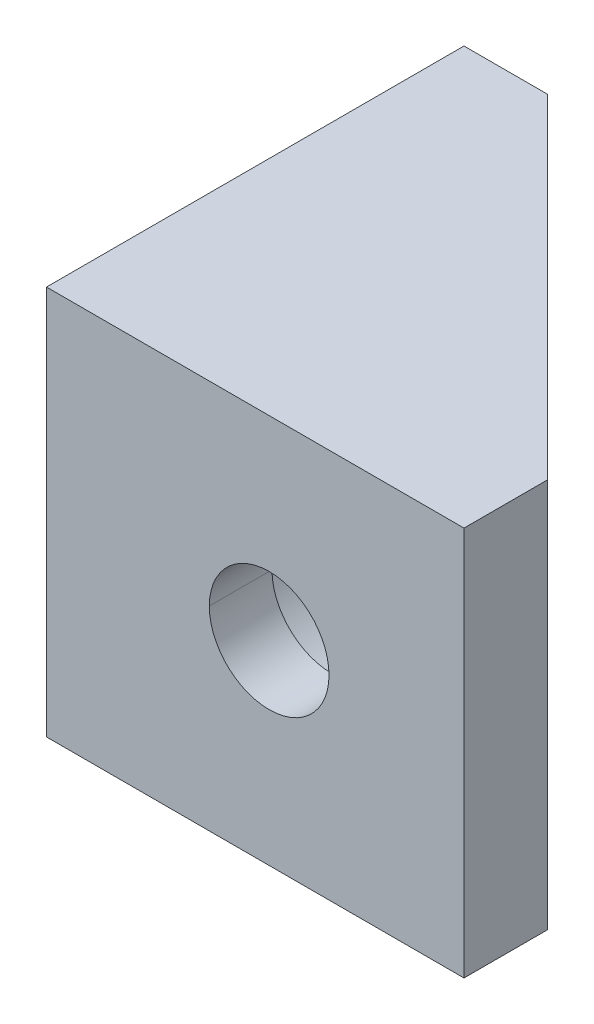
ISO-10303-21;
HEADER;
FILE_DESCRIPTION(('STEP AP214'),'2;1');
FILE_NAME('part.step','',(''),(''),'','','');
FILE_SCHEMA(('AUTOMOTIVE_DESIGN { 1 0 10303 214 1 1 1 1 }'));
ENDSEC;
DATA;
#1=APPLICATION_CONTEXT('core data for automotive mechanical design processes');
#2=APPLICATION_PROTOCOL_DEFINITION('international standard','automotive_design',2000,#1);
#3=PRODUCT_CONTEXT('',#1,'mechanical');
#4=PRODUCT('Part','Part','',(#3));
#5=PRODUCT_RELATED_PRODUCT_CATEGORY('part','',(#4));
#6=PRODUCT_DEFINITION_FORMATION('','',#4);
#7=PRODUCT_DEFINITION_CONTEXT('part definition',#1,'design');
#8=PRODUCT_DEFINITION('design','',#6,#7);
#9=PRODUCT_DEFINITION_SHAPE('','',#8);
#10=(LENGTH_UNIT() NAMED_UNIT(*) SI_UNIT(.MILLI.,.METRE.));
#11=(NAMED_UNIT(*) PLANE_ANGLE_UNIT() SI_UNIT($,.RADIAN.));
#12=(NAMED_UNIT(*) SI_UNIT($,.STERADIAN.) SOLID_ANGLE_UNIT());
#13=UNCERTAINTY_MEASURE_WITH_UNIT(LENGTH_MEASURE(1.E-05),#10,'distance_accuracy_value','');
#14=(GEOMETRIC_REPRESENTATION_CONTEXT(3) GLOBAL_UNCERTAINTY_ASSIGNED_CONTEXT((#13)) GLOBAL_UNIT_ASSIGNED_CONTEXT((#10,
#11,#12)) REPRESENTATION_CONTEXT('',''));
#15=CARTESIAN_POINT('',(0.,0.,0.));
#16=DIRECTION('',(0.,0.,1.));
#17=DIRECTION('',(1.,0.,0.));
#18=AXIS2_PLACEMENT_3D('',#15,#16,#17);
#19=CARTESIAN_POINT('',(0.,7.,-2.25));
#20=DIRECTION('',(0.,0.,-1.));
#21=DIRECTION('',(-1.,0.,0.));
#22=AXIS2_PLACEMENT_3D('',#19,#20,#21);
#23=PLANE('',#22);
#24=CARTESIAN_POINT('',(8.,0.,-2.25000000000003));
#25=DIRECTION('',(0.,0.,1.));
#26=DIRECTION('',(-1.,0.,0.));
#27=AXIS2_PLACEMENT_3D('',#24,#25,#26);
#28=CIRCLE('',#27,2.15);
#29=CARTESIAN_POINT('',(5.85,0.,-2.25000000000002));
#30=VERTEX_POINT('',#29);
#31=CARTESIAN_POINT('',(10.15,0.,-2.25000000000004));
#32=VERTEX_POINT('',#31);
#33=EDGE_CURVE('E211',#30,#32,#28,.T.);
#34=ORIENTED_EDGE('',*,*,#33,.T.);
#35=CARTESIAN_POINT('',(8.,0.,-2.25000000000003));
#36=DIRECTION('',(0.,0.,1.));
#37=DIRECTION('',(-1.,0.,0.));
#38=AXIS2_PLACEMENT_3D('',#35,#36,#37);
#39=CIRCLE('',#38,2.15);
#40=EDGE_CURVE('E19',#32,#30,#39,.T.);
#41=ORIENTED_EDGE('',*,*,#40,.T.);
#42=EDGE_LOOP('',(#34,#41));
#43=FACE_BOUND('',#42,.T.);
#44=CARTESIAN_POINT('',(8.,0.,-2.25000000000004));
#45=DIRECTION('',(0.,0.,1.));
#46=DIRECTION('',(-1.,0.,0.));
#47=AXIS2_PLACEMENT_3D('',#44,#45,#46);
#48=CIRCLE('',#47,4.);
#49=CARTESIAN_POINT('',(12.,0.,-2.25000000000005));
#50=VERTEX_POINT('',#49);
#51=CARTESIAN_POINT('',(4.,0.,-2.25));
#52=VERTEX_POINT('',#51);
#53=EDGE_CURVE('E10',#50,#52,#48,.T.);
#54=ORIENTED_EDGE('',*,*,#53,.F.);
#55=CARTESIAN_POINT('',(8.,0.,-2.25000000000004));
#56=DIRECTION('',(0.,0.,1.));
#57=DIRECTION('',(-1.,0.,0.));
#58=AXIS2_PLACEMENT_3D('',#55,#56,#57);
#59=CIRCLE('',#58,4.);
#60=EDGE_CURVE('E237',#52,#50,#59,.T.);
#61=ORIENTED_EDGE('',*,*,#60,.F.);
#62=EDGE_LOOP('',(#54,#61));
#63=FACE_BOUND('',#62,.T.);
#64=ADVANCED_FACE('F15',(#43,#63),#23,.T.);
#65=CARTESIAN_POINT('',(2.25,7.,0.));
#66=DIRECTION('',(1.,0.,0.));
#67=DIRECTION('',(0.,1.,0.));
#68=AXIS2_PLACEMENT_3D('',#65,#66,#67);
#69=PLANE('',#68);
#70=CARTESIAN_POINT('',(2.25,0.,-8.));
#71=DIRECTION('',(1.,0.,0.));
#72=DIRECTION('',(0.,0.,-1.));
#73=AXIS2_PLACEMENT_3D('',#70,#71,#72);
#74=CIRCLE('',#73,2.15);
#75=CARTESIAN_POINT('',(2.25,0.,-10.15));
#76=VERTEX_POINT('',#75);
#77=CARTESIAN_POINT('',(2.25,0.,-5.85));
#78=VERTEX_POINT('',#77);
#79=EDGE_CURVE('E228',#76,#78,#74,.T.);
#80=ORIENTED_EDGE('',*,*,#79,.F.);
#81=CARTESIAN_POINT('',(2.25,0.,-8.));
#82=DIRECTION('',(1.,0.,0.));
#83=DIRECTION('',(0.,0.,-1.));
#84=AXIS2_PLACEMENT_3D('',#81,#82,#83);
#85=CIRCLE('',#84,2.15);
#86=EDGE_CURVE('E221',#78,#76,#85,.T.);
#87=ORIENTED_EDGE('',*,*,#86,.F.);
#88=EDGE_LOOP('',(#80,#87));
#89=FACE_BOUND('',#88,.T.);
#90=CARTESIAN_POINT('',(2.25,0.,-8.));
#91=DIRECTION('',(-1.,0.,0.));
#92=DIRECTION('',(0.,0.,-1.));
#93=AXIS2_PLACEMENT_3D('',#90,#91,#92);
#94=CIRCLE('',#93,4.);
#95=CARTESIAN_POINT('',(2.25,0.,-4.));
#96=VERTEX_POINT('',#95);
#97=CARTESIAN_POINT('',(2.25,0.,-12.));
#98=VERTEX_POINT('',#97);
#99=EDGE_CURVE('E188',#96,#98,#94,.T.);
#100=ORIENTED_EDGE('',*,*,#99,.F.);
#101=CARTESIAN_POINT('',(2.25,0.,-8.));
#102=DIRECTION('',(-1.,0.,0.));
#103=DIRECTION('',(0.,0.,-1.));
#104=AXIS2_PLACEMENT_3D('',#101,#102,#103);
#105=CIRCLE('',#104,4.);
#106=EDGE_CURVE('E340',#98,#96,#105,.T.);
#107=ORIENTED_EDGE('',*,*,#106,.F.);
#108=EDGE_LOOP('',(#100,#107));
#109=FACE_BOUND('',#108,.T.);
#110=ADVANCED_FACE('F364',(#89,#109),#69,.T.);
#111=CARTESIAN_POINT('',(8.,0.,-15.));
#112=DIRECTION('',(0.,0.,1.));
#113=DIRECTION('',(1.,0.,0.));
#114=AXIS2_PLACEMENT_3D('',#111,#112,#113);
#115=CYLINDRICAL_SURFACE('',#114,4.);
#116=DIRECTION('',(0.,0.,1.));
#117=VECTOR('',#116,1.);
#118=CARTESIAN_POINT('',(3.99999999999994,0.,-15.));
#119=LINE('',#118,#117);
#120=CARTESIAN_POINT('',(4.,0.,-4.));
#121=VERTEX_POINT('',#120);
#122=EDGE_CURVE('E233',#121,#52,#119,.T.);
#123=ORIENTED_EDGE('',*,*,#122,.F.);
#124=CARTESIAN_POINT('',(4.,0.,-4.));
#125=CARTESIAN_POINT('',(3.99999999999998,2.34314575050762,-4.));
#126=CARTESIAN_POINT('',(5.65685424949235,4.,-5.65685424949238));
#127=CARTESIAN_POINT('',(8.,4.,-8.));
#128=(BOUNDED_CURVE() B_SPLINE_CURVE(3,(#124,#125,#126,#127),.UNSPECIFIED.,.F.,
.F.) B_SPLINE_CURVE_WITH_KNOTS((4,4),(0.,1.5707963267949),
.UNSPECIFIED.) CURVE() GEOMETRIC_REPRESENTATION_ITEM() RATIONAL_B_SPLINE_CURVE((1.,
0.804737854124365,0.804737854124365,1.)) REPRESENTATION_ITEM(''));
#129=CARTESIAN_POINT('',(8.,4.,-8.));
#130=VERTEX_POINT('',#129);
#131=EDGE_CURVE('E241',#121,#130,#128,.T.);
#132=ORIENTED_EDGE('',*,*,#131,.T.);
#133=CARTESIAN_POINT('',(8.,4.,-8.));
#134=CARTESIAN_POINT('',(10.3431457505076,4.,-5.65685424949238));
#135=CARTESIAN_POINT('',(12.,2.34314575050762,-3.99999999999999));
#136=CARTESIAN_POINT('',(12.,0.,-4.));
#137=(BOUNDED_CURVE() B_SPLINE_CURVE(3,(#133,#134,#135,#136),.UNSPECIFIED.,.F.,
.F.) B_SPLINE_CURVE_WITH_KNOTS((4,4),(1.5707963267949,3.1415926535898),
.UNSPECIFIED.) CURVE() GEOMETRIC_REPRESENTATION_ITEM() RATIONAL_B_SPLINE_CURVE((1.,
0.804737854124365,0.804737854124365,1.)) REPRESENTATION_ITEM(''));
#138=CARTESIAN_POINT('',(12.,0.,-4.));
#139=VERTEX_POINT('',#138);
#140=EDGE_CURVE('E251',#130,#139,#137,.T.);
#141=ORIENTED_EDGE('',*,*,#140,.T.);
#142=DIRECTION('',(0.,0.,1.));
#143=VECTOR('',#142,1.);
#144=CARTESIAN_POINT('',(12.,0.,-15.));
#145=LINE('',#144,#143);
#146=EDGE_CURVE('E271',#139,#50,#145,.T.);
#147=ORIENTED_EDGE('',*,*,#146,.T.);
#148=ORIENTED_EDGE('',*,*,#53,.T.);
#149=EDGE_LOOP('',(#123,#132,#141,#147,#148));
#150=FACE_BOUND('',#149,.T.);
#151=ADVANCED_FACE('F311',(#150),#115,.F.);
#152=CARTESIAN_POINT('',(8.,0.,-15.));
#153=DIRECTION('',(0.,0.,1.));
#154=DIRECTION('',(1.,0.,0.));
#155=AXIS2_PLACEMENT_3D('',#152,#153,#154);
#156=CYLINDRICAL_SURFACE('',#155,4.);
#157=CARTESIAN_POINT('',(8.,-4.,-8.));
#158=CARTESIAN_POINT('',(8.3378063929906,-4.,-8.33780639299063));
#159=CARTESIAN_POINT('',(8.6729203664262,-3.95743494445507,-8.67292036642625));
#160=CARTESIAN_POINT('',(9.,-3.87298334620741,-9.));
#161=(BOUNDED_CURVE() B_SPLINE_CURVE(3,(#157,#158,#159,#160),.UNSPECIFIED.,.F.,
.F.) B_SPLINE_CURVE_WITH_KNOTS((4,4),(1.5707963267949,1.82347658193698),
.UNSPECIFIED.) CURVE() GEOMETRIC_REPRESENTATION_ITEM() RATIONAL_B_SPLINE_CURVE((1.,
0.994686464178111,0.994686464178111,1.)) REPRESENTATION_ITEM(''));
#162=CARTESIAN_POINT('',(8.,-4.,-8.));
#163=VERTEX_POINT('',#162);
#164=CARTESIAN_POINT('',(9.,-3.87298334620741,-9.));
#165=VERTEX_POINT('',#164);
#166=EDGE_CURVE('E320',#163,#165,#161,.T.);
#167=ORIENTED_EDGE('',*,*,#166,.T.);
#168=CARTESIAN_POINT('',(9.,-3.87298334620741,-9.));
#169=CARTESIAN_POINT('',(6.24744871391585,-4.58368903224647,-11.7525512860842));
#170=CARTESIAN_POINT('',(3.99999999999993,-2.84282274415616,-14.0000000000001));
#171=CARTESIAN_POINT('',(3.99999999999994,0.,-14.));
#172=CARTESIAN_POINT('',(3.99999999999994,2.84282274415617,-14.));
#173=CARTESIAN_POINT('',(6.24744871391586,4.58368903224647,-11.7525512860841));
#174=CARTESIAN_POINT('',(9.,3.87298334620741,-9.));
#175=(BOUNDED_CURVE() B_SPLINE_CURVE(3,(#168,#169,#170,#171,#172,#173,#174),.UNSPECIFIED.,.F.,
.F.) B_SPLINE_CURVE_WITH_KNOTS((4,3,4),(1.31811607165281,3.1415926535898,4.96506923552678),
.UNSPECIFIED.) CURVE() GEOMETRIC_REPRESENTATION_ITEM() RATIONAL_B_SPLINE_CURVE((1.,
0.741581623797195,0.741581623797195,1.,0.741581623797195,0.741581623797195,1.)) REPRESENTATION_ITEM(''));
#176=CARTESIAN_POINT('',(9.,3.87298334620741,-9.));
#177=VERTEX_POINT('',#176);
#178=EDGE_CURVE('E198',#165,#177,#175,.T.);
#179=ORIENTED_EDGE('',*,*,#178,.T.);
#180=CARTESIAN_POINT('',(9.,3.87298334620741,-9.));
#181=CARTESIAN_POINT('',(8.6729203664262,3.95743494445507,-8.67292036642625));
#182=CARTESIAN_POINT('',(8.3378063929906,4.,-8.33780639299063));
#183=CARTESIAN_POINT('',(8.,4.,-8.));
#184=(BOUNDED_CURVE() B_SPLINE_CURVE(3,(#180,#181,#182,#183),.UNSPECIFIED.,.F.,
.F.) B_SPLINE_CURVE_WITH_KNOTS((4,4),(4.4597087252426,4.71238898038469),
.UNSPECIFIED.) CURVE() GEOMETRIC_REPRESENTATION_ITEM() RATIONAL_B_SPLINE_CURVE((1.,
0.994686464178111,0.994686464178111,1.)) REPRESENTATION_ITEM(''));
#185=EDGE_CURVE('E192',#177,#130,#184,.T.);
#186=ORIENTED_EDGE('',*,*,#185,.T.);
#187=CARTESIAN_POINT('',(8.,4.,-8.));
#188=CARTESIAN_POINT('',(5.65685424949234,4.,-10.3431457505076));
#189=CARTESIAN_POINT('',(3.99999999999994,2.34314575050762,-12.));
#190=CARTESIAN_POINT('',(3.99999999999995,0.,-12.));
#191=(BOUNDED_CURVE() B_SPLINE_CURVE(3,(#187,#188,#189,#190),.UNSPECIFIED.,.F.,
.F.) B_SPLINE_CURVE_WITH_KNOTS((4,4),(4.71238898038469,6.28318530717959),
.UNSPECIFIED.) CURVE() GEOMETRIC_REPRESENTATION_ITEM() RATIONAL_B_SPLINE_CURVE((1.,
0.804737854124365,0.804737854124365,1.)) REPRESENTATION_ITEM(''));
#192=CARTESIAN_POINT('',(3.99999999999995,0.,-12.));
#193=VERTEX_POINT('',#192);
#194=EDGE_CURVE('E250',#130,#193,#191,.T.);
#195=ORIENTED_EDGE('',*,*,#194,.T.);
#196=CARTESIAN_POINT('',(3.99999999999995,0.,-12.));
#197=CARTESIAN_POINT('',(3.99999999999994,-2.34314575050762,-12.));
#198=CARTESIAN_POINT('',(5.65685424949234,-4.,-10.3431457505076));
#199=CARTESIAN_POINT('',(8.,-4.,-8.));
#200=(BOUNDED_CURVE() B_SPLINE_CURVE(3,(#196,#197,#198,#199),.UNSPECIFIED.,.F.,
.F.) B_SPLINE_CURVE_WITH_KNOTS((4,4),(0.,1.5707963267949),
.UNSPECIFIED.) CURVE() GEOMETRIC_REPRESENTATION_ITEM() RATIONAL_B_SPLINE_CURVE((1.,
0.804737854124365,0.804737854124365,1.)) REPRESENTATION_ITEM(''));
#201=EDGE_CURVE('E272',#193,#163,#200,.T.);
#202=ORIENTED_EDGE('',*,*,#201,.T.);
#203=EDGE_LOOP('',(#167,#179,#186,#195,#202));
#204=FACE_BOUND('',#203,.T.);
#205=ADVANCED_FACE('F297',(#204),#156,.F.);
#206=CARTESIAN_POINT('',(0.,-7.,0.));
#207=DIRECTION('',(0.,1.,0.));
#208=DIRECTION('',(1.,0.,0.));
#209=AXIS2_PLACEMENT_3D('',#206,#207,#208);
#210=PLANE('',#209);
#211=DIRECTION('',(1.,0.,0.));
#212=VECTOR('',#211,1.);
#213=CARTESIAN_POINT('',(0.,-7.,0.));
#214=LINE('',#213,#212);
#215=CARTESIAN_POINT('',(0.,-7.,0.));
#216=VERTEX_POINT('',#215);
#217=CARTESIAN_POINT('',(15.,-7.,0.));
#218=VERTEX_POINT('',#217);
#219=EDGE_CURVE('E196',#216,#218,#214,.T.);
#220=ORIENTED_EDGE('',*,*,#219,.F.);
#221=DIRECTION('',(0.,0.,1.));
#222=VECTOR('',#221,1.);
#223=CARTESIAN_POINT('',(0.,-7.,0.));
#224=LINE('',#223,#222);
#225=CARTESIAN_POINT('',(0.,-7.,-15.));
#226=VERTEX_POINT('',#225);
#227=EDGE_CURVE('E180',#226,#216,#224,.T.);
#228=ORIENTED_EDGE('',*,*,#227,.F.);
#229=DIRECTION('',(-1.,0.,0.));
#230=VECTOR('',#229,1.);
#231=CARTESIAN_POINT('',(0.,-7.,-15.));
#232=LINE('',#231,#230);
#233=CARTESIAN_POINT('',(3.,-7.,-15.));
#234=VERTEX_POINT('',#233);
#235=EDGE_CURVE('E210',#234,#226,#232,.T.);
#236=ORIENTED_EDGE('',*,*,#235,.F.);
#237=DIRECTION('',(-0.707106781186549,0.,-0.707106781186546));
#238=VECTOR('',#237,1.);
#239=CARTESIAN_POINT('',(3.,-7.,-15.));
#240=LINE('',#239,#238);
#241=CARTESIAN_POINT('',(15.,-7.,-3.00000000000006));
#242=VERTEX_POINT('',#241);
#243=EDGE_CURVE('E223',#242,#234,#240,.T.);
#244=ORIENTED_EDGE('',*,*,#243,.F.);
#245=DIRECTION('',(0.,0.,-1.));
#246=VECTOR('',#245,1.);
#247=CARTESIAN_POINT('',(15.,-7.,0.));
#248=LINE('',#247,#246);
#249=EDGE_CURVE('E166',#218,#242,#248,.T.);
#250=ORIENTED_EDGE('',*,*,#249,.F.);
#251=EDGE_LOOP('',(#220,#228,#236,#244,#250));
#252=FACE_BOUND('',#251,.T.);
#253=ADVANCED_FACE('F394',(#252),#210,.F.);
#254=CARTESIAN_POINT('',(0.,7.,0.));
#255=DIRECTION('',(0.,1.,0.));
#256=DIRECTION('',(1.,0.,0.));
#257=AXIS2_PLACEMENT_3D('',#254,#255,#256);
#258=PLANE('',#257);
#259=DIRECTION('',(1.,0.,0.));
#260=VECTOR('',#259,1.);
#261=CARTESIAN_POINT('',(0.,7.,0.));
#262=LINE('',#261,#260);
#263=CARTESIAN_POINT('',(0.,7.,0.));
#264=VERTEX_POINT('',#263);
#265=CARTESIAN_POINT('',(15.,7.,0.));
#266=VERTEX_POINT('',#265);
#267=EDGE_CURVE('E156',#264,#266,#262,.T.);
#268=ORIENTED_EDGE('',*,*,#267,.T.);
#269=DIRECTION('',(0.,0.,-1.));
#270=VECTOR('',#269,1.);
#271=CARTESIAN_POINT('',(15.,7.,0.));
#272=LINE('',#271,#270);
#273=CARTESIAN_POINT('',(15.,7.,-3.00000000000006));
#274=VERTEX_POINT('',#273);
#275=EDGE_CURVE('E40',#266,#274,#272,.T.);
#276=ORIENTED_EDGE('',*,*,#275,.T.);
#277=DIRECTION('',(-0.707106781186549,0.,-0.707106781186546));
#278=VECTOR('',#277,1.);
#279=CARTESIAN_POINT('',(3.,7.,-15.));
#280=LINE('',#279,#278);
#281=CARTESIAN_POINT('',(3.,7.,-15.));
#282=VERTEX_POINT('',#281);
#283=EDGE_CURVE('E232',#274,#282,#280,.T.);
#284=ORIENTED_EDGE('',*,*,#283,.T.);
#285=DIRECTION('',(-1.,0.,0.));
#286=VECTOR('',#285,1.);
#287=CARTESIAN_POINT('',(0.,7.,-15.));
#288=LINE('',#287,#286);
#289=CARTESIAN_POINT('',(0.,7.,-15.));
#290=VERTEX_POINT('',#289);
#291=EDGE_CURVE('E26',#282,#290,#288,.T.);
#292=ORIENTED_EDGE('',*,*,#291,.T.);
#293=DIRECTION('',(0.,0.,1.));
#294=VECTOR('',#293,1.);
#295=CARTESIAN_POINT('',(0.,7.,0.));
#296=LINE('',#295,#294);
#297=EDGE_CURVE('E169',#290,#264,#296,.T.);
#298=ORIENTED_EDGE('',*,*,#297,.T.);
#299=EDGE_LOOP('',(#268,#276,#284,#292,#298));
#300=FACE_BOUND('',#299,.T.);
#301=ADVANCED_FACE('F170',(#300),#258,.T.);
#302=CARTESIAN_POINT('',(0.,7.,-15.));
#303=DIRECTION('',(0.,0.,1.));
#304=DIRECTION('',(1.,0.,0.));
#305=AXIS2_PLACEMENT_3D('',#302,#303,#304);
#306=PLANE('',#305);
#307=ORIENTED_EDGE('',*,*,#235,.T.);
#308=DIRECTION('',(0.,-1.,0.));
#309=VECTOR('',#308,1.);
#310=CARTESIAN_POINT('',(0.,7.,-15.));
#311=LINE('',#310,#309);
#312=EDGE_CURVE('E176',#290,#226,#311,.T.);
#313=ORIENTED_EDGE('',*,*,#312,.F.);
#314=ORIENTED_EDGE('',*,*,#291,.F.);
#315=DIRECTION('',(0.,-1.,0.));
#316=VECTOR('',#315,1.);
#317=CARTESIAN_POINT('',(3.,7.,-15.));
#318=LINE('',#317,#316);
#319=EDGE_CURVE('E227',#282,#234,#318,.T.);
#320=ORIENTED_EDGE('',*,*,#319,.T.);
#321=EDGE_LOOP('',(#307,#313,#314,#320));
#322=FACE_BOUND('',#321,.T.);
#323=ADVANCED_FACE('F378',(#322),#306,.F.);
#324=CARTESIAN_POINT('',(15.,7.,0.));
#325=DIRECTION('',(-1.,0.,0.));
#326=DIRECTION('',(0.,1.,0.));
#327=AXIS2_PLACEMENT_3D('',#324,#325,#326);
#328=PLANE('',#327);
#329=ORIENTED_EDGE('',*,*,#249,.T.);
#330=DIRECTION('',(0.,-1.,0.));
#331=VECTOR('',#330,1.);
#332=CARTESIAN_POINT('',(15.,7.,-3.00000000000006));
#333=LINE('',#332,#331);
#334=EDGE_CURVE('E203',#274,#242,#333,.T.);
#335=ORIENTED_EDGE('',*,*,#334,.F.);
#336=ORIENTED_EDGE('',*,*,#275,.F.);
#337=DIRECTION('',(0.,-1.,0.));
#338=VECTOR('',#337,1.);
#339=CARTESIAN_POINT('',(15.,7.,0.));
#340=LINE('',#339,#338);
#341=EDGE_CURVE('E163',#266,#218,#340,.T.);
#342=ORIENTED_EDGE('',*,*,#341,.T.);
#343=EDGE_LOOP('',(#329,#335,#336,#342));
#344=FACE_BOUND('',#343,.T.);
#345=ADVANCED_FACE('F704',(#344),#328,.F.);
#346=CARTESIAN_POINT('',(0.,7.,0.));
#347=DIRECTION('',(0.,0.,-1.));
#348=DIRECTION('',(-1.,0.,0.));
#349=AXIS2_PLACEMENT_3D('',#346,#347,#348);
#350=PLANE('',#349);
#351=CARTESIAN_POINT('',(8.,0.,0.));
#352=DIRECTION('',(0.,0.,-1.));
#353=DIRECTION('',(-1.,0.,0.));
#354=AXIS2_PLACEMENT_3D('',#351,#352,#353);
#355=CIRCLE('',#354,2.15);
#356=CARTESIAN_POINT('',(5.85,0.,0.));
#357=VERTEX_POINT('',#356);
#358=CARTESIAN_POINT('',(10.15,0.,0.));
#359=VERTEX_POINT('',#358);
#360=EDGE_CURVE('E441',#357,#359,#355,.T.);
#361=ORIENTED_EDGE('',*,*,#360,.T.);
#362=CARTESIAN_POINT('',(8.,0.,0.));
#363=DIRECTION('',(0.,0.,-1.));
#364=DIRECTION('',(-1.,0.,0.));
#365=AXIS2_PLACEMENT_3D('',#362,#363,#364);
#366=CIRCLE('',#365,2.15);
#367=EDGE_CURVE('E245',#359,#357,#366,.T.);
#368=ORIENTED_EDGE('',*,*,#367,.T.);
#369=EDGE_LOOP('',(#361,#368));
#370=FACE_BOUND('',#369,.T.);
#371=ORIENTED_EDGE('',*,*,#219,.T.);
#372=ORIENTED_EDGE('',*,*,#341,.F.);
#373=ORIENTED_EDGE('',*,*,#267,.F.);
#374=DIRECTION('',(0.,-1.,0.));
#375=VECTOR('',#374,1.);
#376=CARTESIAN_POINT('',(0.,7.,0.));
#377=LINE('',#376,#375);
#378=EDGE_CURVE('E161',#264,#216,#377,.T.);
#379=ORIENTED_EDGE('',*,*,#378,.T.);
#380=EDGE_LOOP('',(#371,#372,#373,#379));
#381=FACE_BOUND('',#380,.T.);
#382=ADVANCED_FACE('F159',(#370,#381),#350,.F.);
#383=CARTESIAN_POINT('',(0.,7.,0.));
#384=DIRECTION('',(1.,0.,0.));
#385=DIRECTION('',(0.,1.,0.));
#386=AXIS2_PLACEMENT_3D('',#383,#384,#385);
#387=PLANE('',#386);
#388=CARTESIAN_POINT('',(0.,0.,-8.));
#389=DIRECTION('',(-1.,0.,0.));
#390=DIRECTION('',(0.,0.,1.));
#391=AXIS2_PLACEMENT_3D('',#388,#389,#390);
#392=CIRCLE('',#391,2.15);
#393=CARTESIAN_POINT('',(0.,0.,-10.15));
#394=VERTEX_POINT('',#393);
#395=CARTESIAN_POINT('',(0.,0.,-5.85));
#396=VERTEX_POINT('',#395);
#397=EDGE_CURVE('E222',#394,#396,#392,.T.);
#398=ORIENTED_EDGE('',*,*,#397,.F.);
#399=CARTESIAN_POINT('',(0.,0.,-8.));
#400=DIRECTION('',(-1.,0.,0.));
#401=DIRECTION('',(0.,0.,1.));
#402=AXIS2_PLACEMENT_3D('',#399,#400,#401);
#403=CIRCLE('',#402,2.15);
#404=EDGE_CURVE('E267',#396,#394,#403,.T.);
#405=ORIENTED_EDGE('',*,*,#404,.F.);
#406=EDGE_LOOP('',(#398,#405));
#407=FACE_BOUND('',#406,.T.);
#408=ORIENTED_EDGE('',*,*,#227,.T.);
#409=ORIENTED_EDGE('',*,*,#378,.F.);
#410=ORIENTED_EDGE('',*,*,#297,.F.);
#411=ORIENTED_EDGE('',*,*,#312,.T.);
#412=EDGE_LOOP('',(#408,#409,#410,#411));
#413=FACE_BOUND('',#412,.T.);
#414=ADVANCED_FACE('F178',(#407,#413),#387,.F.);
#415=CARTESIAN_POINT('',(15.,0.,-8.));
#416=DIRECTION('',(-1.,0.,0.));
#417=DIRECTION('',(0.,0.,1.));
#418=AXIS2_PLACEMENT_3D('',#415,#416,#417);
#419=CYLINDRICAL_SURFACE('',#418,4.);
#420=DIRECTION('',(-1.,0.,0.));
#421=VECTOR('',#420,1.);
#422=CARTESIAN_POINT('',(15.,0.,-12.));
#423=LINE('',#422,#421);
#424=EDGE_CURVE('E277',#193,#98,#423,.T.);
#425=ORIENTED_EDGE('',*,*,#424,.F.);
#426=ORIENTED_EDGE('',*,*,#194,.F.);
#427=ORIENTED_EDGE('',*,*,#131,.F.);
#428=DIRECTION('',(-1.,0.,0.));
#429=VECTOR('',#428,1.);
#430=CARTESIAN_POINT('',(15.,0.,-4.));
#431=LINE('',#430,#429);
#432=EDGE_CURVE('E334',#121,#96,#431,.T.);
#433=ORIENTED_EDGE('',*,*,#432,.T.);
#434=ORIENTED_EDGE('',*,*,#99,.T.);
#435=EDGE_LOOP('',(#425,#426,#427,#433,#434));
#436=FACE_BOUND('',#435,.T.);
#437=ADVANCED_FACE('F17',(#436),#419,.F.);
#438=CARTESIAN_POINT('',(15.,0.,-8.));
#439=DIRECTION('',(-1.,0.,0.));
#440=DIRECTION('',(0.,0.,1.));
#441=AXIS2_PLACEMENT_3D('',#438,#439,#440);
#442=CYLINDRICAL_SURFACE('',#441,4.);
#443=DIRECTION('',(-1.,0.,0.));
#444=VECTOR('',#443,1.);
#445=CARTESIAN_POINT('',(15.,0.,-4.));
#446=LINE('',#445,#444);
#447=CARTESIAN_POINT('',(14.,0.,-4.));
#448=VERTEX_POINT('',#447);
#449=EDGE_CURVE('E258',#448,#139,#446,.T.);
#450=ORIENTED_EDGE('',*,*,#449,.F.);
#451=CARTESIAN_POINT('',(9.,-3.87298334620741,-9.));
#452=CARTESIAN_POINT('',(11.7525512860841,-4.58368903224648,-6.24744871391592));
#453=CARTESIAN_POINT('',(14.,-2.84282274415617,-4.));
#454=CARTESIAN_POINT('',(14.,0.,-4.));
#455=(BOUNDED_CURVE() B_SPLINE_CURVE(3,(#451,#452,#453,#454),.UNSPECIFIED.,.F.,
.F.) B_SPLINE_CURVE_WITH_KNOTS((4,4),(1.31811607165281,3.1415926535898),
.UNSPECIFIED.) CURVE() GEOMETRIC_REPRESENTATION_ITEM() RATIONAL_B_SPLINE_CURVE((1.,
0.741581623797194,0.741581623797194,1.)) REPRESENTATION_ITEM(''));
#456=EDGE_CURVE('E202',#165,#448,#455,.T.);
#457=ORIENTED_EDGE('',*,*,#456,.F.);
#458=ORIENTED_EDGE('',*,*,#166,.F.);
#459=CARTESIAN_POINT('',(12.,0.,-4.));
#460=CARTESIAN_POINT('',(12.,-2.34314575050762,-3.99999999999999));
#461=CARTESIAN_POINT('',(10.3431457505076,-4.,-5.65685424949238));
#462=CARTESIAN_POINT('',(8.,-4.,-8.));
#463=(BOUNDED_CURVE() B_SPLINE_CURVE(3,(#459,#460,#461,#462),.UNSPECIFIED.,.F.,
.F.) B_SPLINE_CURVE_WITH_KNOTS((4,4),(3.1415926535898,4.71238898038469),
.UNSPECIFIED.) CURVE() GEOMETRIC_REPRESENTATION_ITEM() RATIONAL_B_SPLINE_CURVE((1.,
0.804737854124365,0.804737854124365,1.)) REPRESENTATION_ITEM(''));
#464=EDGE_CURVE('E278',#139,#163,#463,.T.);
#465=ORIENTED_EDGE('',*,*,#464,.F.);
#466=EDGE_LOOP('',(#450,#457,#458,#465));
#467=FACE_BOUND('',#466,.T.);
#468=ADVANCED_FACE('F383',(#467),#442,.F.);
#469=CARTESIAN_POINT('',(3.,7.,-15.));
#470=DIRECTION('',(-0.707106781186546,0.,0.707106781186549));
#471=DIRECTION('',(0.,1.,0.));
#472=AXIS2_PLACEMENT_3D('',#469,#470,#471);
#473=PLANE('',#472);
#474=ORIENTED_EDGE('',*,*,#178,.F.);
#475=ORIENTED_EDGE('',*,*,#456,.T.);
#476=CARTESIAN_POINT('',(14.,0.,-4.));
#477=CARTESIAN_POINT('',(14.,2.84282274415617,-4.));
#478=CARTESIAN_POINT('',(11.7525512860841,4.58368903224648,-6.24744871391591));
#479=CARTESIAN_POINT('',(9.,3.87298334620741,-9.));
#480=(BOUNDED_CURVE() B_SPLINE_CURVE(3,(#476,#477,#478,#479),.UNSPECIFIED.,.F.,
.F.) B_SPLINE_CURVE_WITH_KNOTS((4,4),(3.1415926535898,4.96506923552678),
.UNSPECIFIED.) CURVE() GEOMETRIC_REPRESENTATION_ITEM() RATIONAL_B_SPLINE_CURVE((1.,
0.741581623797194,0.741581623797194,1.)) REPRESENTATION_ITEM(''));
#481=EDGE_CURVE('E339',#448,#177,#480,.T.);
#482=ORIENTED_EDGE('',*,*,#481,.T.);
#483=EDGE_LOOP('',(#474,#475,#482));
#484=FACE_BOUND('',#483,.T.);
#485=ORIENTED_EDGE('',*,*,#243,.T.);
#486=ORIENTED_EDGE('',*,*,#319,.F.);
#487=ORIENTED_EDGE('',*,*,#283,.F.);
#488=ORIENTED_EDGE('',*,*,#334,.T.);
#489=EDGE_LOOP('',(#485,#486,#487,#488));
#490=FACE_BOUND('',#489,.T.);
#491=ADVANCED_FACE('F379',(#484,#490),#473,.F.);
#492=CARTESIAN_POINT('',(0.,0.,-8.));
#493=DIRECTION('',(1.,0.,0.));
#494=DIRECTION('',(0.,0.,-1.));
#495=AXIS2_PLACEMENT_3D('',#492,#493,#494);
#496=CYLINDRICAL_SURFACE('',#495,2.15);
#497=DIRECTION('',(1.,0.,0.));
#498=VECTOR('',#497,1.);
#499=CARTESIAN_POINT('',(0.,0.,-5.85));
#500=LINE('',#499,#498);
#501=EDGE_CURVE('E217',#396,#78,#500,.T.);
#502=ORIENTED_EDGE('',*,*,#501,.F.);
#503=ORIENTED_EDGE('',*,*,#404,.T.);
#504=DIRECTION('',(1.,0.,0.));
#505=VECTOR('',#504,1.);
#506=CARTESIAN_POINT('',(0.,0.,-10.15));
#507=LINE('',#506,#505);
#508=EDGE_CURVE('E431',#394,#76,#507,.T.);
#509=ORIENTED_EDGE('',*,*,#508,.T.);
#510=ORIENTED_EDGE('',*,*,#79,.T.);
#511=EDGE_LOOP('',(#502,#503,#509,#510));
#512=FACE_BOUND('',#511,.T.);
#513=ADVANCED_FACE('F382',(#512),#496,.F.);
#514=CARTESIAN_POINT('',(8.,0.,0.));
#515=DIRECTION('',(0.,0.,-1.));
#516=DIRECTION('',(-1.,0.,0.));
#517=AXIS2_PLACEMENT_3D('',#514,#515,#516);
#518=CYLINDRICAL_SURFACE('',#517,2.15);
#519=DIRECTION('',(0.,0.,-1.));
#520=VECTOR('',#519,1.);
#521=CARTESIAN_POINT('',(10.15,0.,0.));
#522=LINE('',#521,#520);
#523=EDGE_CURVE('E216',#359,#32,#522,.T.);
#524=ORIENTED_EDGE('',*,*,#523,.F.);
#525=ORIENTED_EDGE('',*,*,#360,.F.);
#526=DIRECTION('',(0.,0.,-1.));
#527=VECTOR('',#526,1.);
#528=CARTESIAN_POINT('',(5.85,0.,0.));
#529=LINE('',#528,#527);
#530=EDGE_CURVE('E215',#357,#30,#529,.T.);
#531=ORIENTED_EDGE('',*,*,#530,.T.);
#532=ORIENTED_EDGE('',*,*,#40,.F.);
#533=EDGE_LOOP('',(#524,#525,#531,#532));
#534=FACE_BOUND('',#533,.T.);
#535=ADVANCED_FACE('F389',(#534),#518,.F.);
#536=CARTESIAN_POINT('',(8.,0.,0.));
#537=DIRECTION('',(0.,0.,-1.));
#538=DIRECTION('',(-1.,0.,0.));
#539=AXIS2_PLACEMENT_3D('',#536,#537,#538);
#540=CYLINDRICAL_SURFACE('',#539,2.15);
#541=ORIENTED_EDGE('',*,*,#367,.F.);
#542=ORIENTED_EDGE('',*,*,#523,.T.);
#543=ORIENTED_EDGE('',*,*,#33,.F.);
#544=ORIENTED_EDGE('',*,*,#530,.F.);
#545=EDGE_LOOP('',(#541,#542,#543,#544));
#546=FACE_BOUND('',#545,.T.);
#547=ADVANCED_FACE('F385',(#546),#540,.F.);
#548=CARTESIAN_POINT('',(0.,0.,-8.));
#549=DIRECTION('',(1.,0.,0.));
#550=DIRECTION('',(0.,0.,-1.));
#551=AXIS2_PLACEMENT_3D('',#548,#549,#550);
#552=CYLINDRICAL_SURFACE('',#551,2.15);
#553=ORIENTED_EDGE('',*,*,#397,.T.);
#554=ORIENTED_EDGE('',*,*,#501,.T.);
#555=ORIENTED_EDGE('',*,*,#86,.T.);
#556=ORIENTED_EDGE('',*,*,#508,.F.);
#557=EDGE_LOOP('',(#553,#554,#555,#556));
#558=FACE_BOUND('',#557,.T.);
#559=ADVANCED_FACE('F388',(#558),#552,.F.);
#560=CARTESIAN_POINT('',(15.,0.,-8.));
#561=DIRECTION('',(-1.,0.,0.));
#562=DIRECTION('',(0.,0.,1.));
#563=AXIS2_PLACEMENT_3D('',#560,#561,#562);
#564=CYLINDRICAL_SURFACE('',#563,4.);
#565=ORIENTED_EDGE('',*,*,#481,.F.);
#566=ORIENTED_EDGE('',*,*,#449,.T.);
#567=ORIENTED_EDGE('',*,*,#140,.F.);
#568=ORIENTED_EDGE('',*,*,#185,.F.);
#569=EDGE_LOOP('',(#565,#566,#567,#568));
#570=FACE_BOUND('',#569,.T.);
#571=ADVANCED_FACE('F305',(#570),#564,.F.);
#572=CARTESIAN_POINT('',(15.,0.,-8.));
#573=DIRECTION('',(-1.,0.,0.));
#574=DIRECTION('',(0.,0.,1.));
#575=AXIS2_PLACEMENT_3D('',#572,#573,#574);
#576=CYLINDRICAL_SURFACE('',#575,4.);
#577=ORIENTED_EDGE('',*,*,#201,.F.);
#578=ORIENTED_EDGE('',*,*,#424,.T.);
#579=ORIENTED_EDGE('',*,*,#106,.T.);
#580=ORIENTED_EDGE('',*,*,#432,.F.);
#581=CARTESIAN_POINT('',(8.,-4.,-8.));
#582=CARTESIAN_POINT('',(5.65685424949235,-4.,-5.65685424949238));
#583=CARTESIAN_POINT('',(3.99999999999998,-2.34314575050762,-4.));
#584=CARTESIAN_POINT('',(4.,0.,-4.));
#585=(BOUNDED_CURVE() B_SPLINE_CURVE(3,(#581,#582,#583,#584),.UNSPECIFIED.,.F.,
.F.) B_SPLINE_CURVE_WITH_KNOTS((4,4),(4.71238898038469,6.28318530717959),
.UNSPECIFIED.) CURVE() GEOMETRIC_REPRESENTATION_ITEM() RATIONAL_B_SPLINE_CURVE((1.,
0.804737854124365,0.804737854124365,1.)) REPRESENTATION_ITEM(''));
#586=EDGE_CURVE('E238',#163,#121,#585,.T.);
#587=ORIENTED_EDGE('',*,*,#586,.F.);
#588=EDGE_LOOP('',(#577,#578,#579,#580,#587));
#589=FACE_BOUND('',#588,.T.);
#590=ADVANCED_FACE('F361',(#589),#576,.F.);
#591=CARTESIAN_POINT('',(8.,0.,-15.));
#592=DIRECTION('',(0.,0.,1.));
#593=DIRECTION('',(1.,0.,0.));
#594=AXIS2_PLACEMENT_3D('',#591,#592,#593);
#595=CYLINDRICAL_SURFACE('',#594,4.);
#596=ORIENTED_EDGE('',*,*,#586,.T.);
#597=ORIENTED_EDGE('',*,*,#122,.T.);
#598=ORIENTED_EDGE('',*,*,#60,.T.);
#599=ORIENTED_EDGE('',*,*,#146,.F.);
#600=ORIENTED_EDGE('',*,*,#464,.T.);
#601=EDGE_LOOP('',(#596,#597,#598,#599,#600));
#602=FACE_BOUND('',#601,.T.);
#603=ADVANCED_FACE('F457',(#602),#595,.F.);
#604=CLOSED_SHELL('',(#64,#110,#151,#205,#253,#301,#323,#345,#382,#414,#437,#468,#491,#513,#535,
#547,#559,#571,#590,#603));
#605=MANIFOLD_SOLID_BREP('B1',#604);
#606=ADVANCED_BREP_SHAPE_REPRESENTATION('',(#18,#605),#14);
#607=SHAPE_DEFINITION_REPRESENTATION(#9,#606);
ENDSEC;
END-ISO-10303-21;
